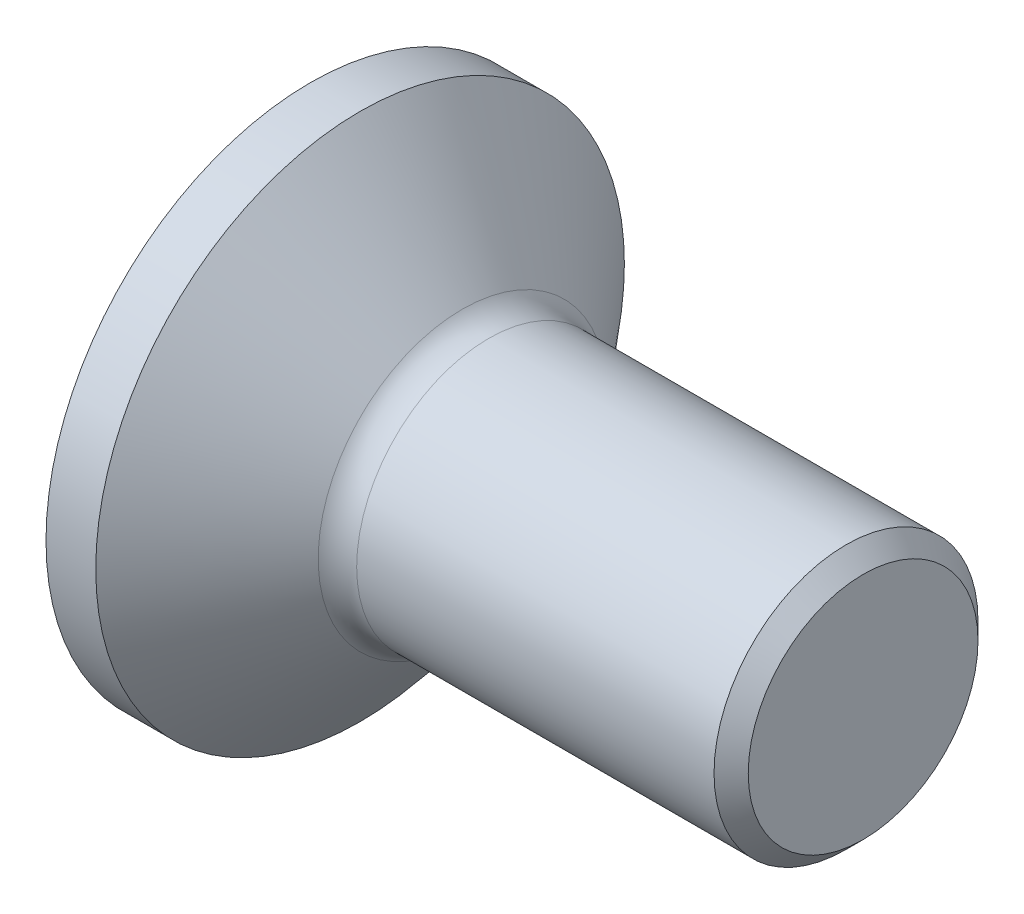
ISO-10303-21;
HEADER;
FILE_DESCRIPTION(('STEP AP214'),'2;1');
FILE_NAME('part.step','',(''),(''),'','','');
FILE_SCHEMA(('AUTOMOTIVE_DESIGN { 1 0 10303 214 1 1 1 1 }'));
ENDSEC;
DATA;
#1=APPLICATION_CONTEXT('core data for automotive mechanical design processes');
#2=APPLICATION_PROTOCOL_DEFINITION('international standard','automotive_design',2000,#1);
#3=PRODUCT_CONTEXT('',#1,'mechanical');
#4=PRODUCT('Part','Part','',(#3));
#5=PRODUCT_RELATED_PRODUCT_CATEGORY('part','',(#4));
#6=PRODUCT_DEFINITION_FORMATION('','',#4);
#7=PRODUCT_DEFINITION_CONTEXT('part definition',#1,'design');
#8=PRODUCT_DEFINITION('design','',#6,#7);
#9=PRODUCT_DEFINITION_SHAPE('','',#8);
#10=(LENGTH_UNIT() NAMED_UNIT(*) SI_UNIT(.MILLI.,.METRE.));
#11=(NAMED_UNIT(*) PLANE_ANGLE_UNIT() SI_UNIT($,.RADIAN.));
#12=(NAMED_UNIT(*) SI_UNIT($,.STERADIAN.) SOLID_ANGLE_UNIT());
#13=UNCERTAINTY_MEASURE_WITH_UNIT(LENGTH_MEASURE(1.E-05),#10,'distance_accuracy_value','');
#14=(GEOMETRIC_REPRESENTATION_CONTEXT(3) GLOBAL_UNCERTAINTY_ASSIGNED_CONTEXT((#13)) GLOBAL_UNIT_ASSIGNED_CONTEXT((#10,
#11,#12)) REPRESENTATION_CONTEXT('',''));
#15=CARTESIAN_POINT('',(0.,0.,0.));
#16=DIRECTION('',(0.,0.,1.));
#17=DIRECTION('',(1.,0.,0.));
#18=AXIS2_PLACEMENT_3D('',#15,#16,#17);
#19=CARTESIAN_POINT('',(2.58077461814255,0.,0.));
#20=DIRECTION('',(1.,0.,0.));
#21=DIRECTION('',(0.,1.,0.));
#22=AXIS2_PLACEMENT_3D('',#19,#20,#21);
#23=TOROIDAL_SURFACE('',#22,2.41,0.5);
#24=CARTESIAN_POINT('',(2.2,0.,0.));
#25=DIRECTION('',(1.,0.,0.));
#26=DIRECTION('',(0.,1.,0.));
#27=AXIS2_PLACEMENT_3D('',#24,#25,#26);
#28=CIRCLE('',#27,2.08594647019606);
#29=CARTESIAN_POINT('',(2.2,2.08594647019606,0.));
#30=VERTEX_POINT('',#29);
#31=EDGE_CURVE('E134',#30,#30,#28,.T.);
#32=ORIENTED_EDGE('',*,*,#31,.T.);
#33=EDGE_LOOP('',(#32));
#34=FACE_BOUND('',#33,.T.);
#35=CARTESIAN_POINT('',(2.58077461814255,0.,0.));
#36=DIRECTION('',(1.,0.,0.));
#37=DIRECTION('',(0.,1.,0.));
#38=AXIS2_PLACEMENT_3D('',#35,#36,#37);
#39=CIRCLE('',#38,1.91);
#40=CARTESIAN_POINT('',(2.58077461814255,1.91,0.));
#41=VERTEX_POINT('',#40);
#42=EDGE_CURVE('E11',#41,#41,#39,.T.);
#43=ORIENTED_EDGE('',*,*,#42,.F.);
#44=EDGE_LOOP('',(#43));
#45=FACE_BOUND('',#44,.T.);
#46=ADVANCED_FACE('F33',(#34,#45),#23,.F.);
#47=CARTESIAN_POINT('',(0.,0.,0.));
#48=DIRECTION('',(1.,0.,0.));
#49=DIRECTION('',(0.,1.,0.));
#50=AXIS2_PLACEMENT_3D('',#47,#48,#49);
#51=CYLINDRICAL_SURFACE('',#50,1.91);
#52=ORIENTED_EDGE('',*,*,#42,.T.);
#53=EDGE_LOOP('',(#52));
#54=FACE_BOUND('',#53,.T.);
#55=CARTESIAN_POINT('',(7.75251262658471,0.,0.));
#56=DIRECTION('',(1.,0.,0.));
#57=DIRECTION('',(0.,1.,0.));
#58=AXIS2_PLACEMENT_3D('',#55,#56,#57);
#59=CIRCLE('',#58,1.91);
#60=CARTESIAN_POINT('',(7.75251262658471,1.91,0.));
#61=VERTEX_POINT('',#60);
#62=EDGE_CURVE('E40',#61,#61,#59,.T.);
#63=ORIENTED_EDGE('',*,*,#62,.F.);
#64=EDGE_LOOP('',(#63));
#65=FACE_BOUND('',#64,.T.);
#66=ADVANCED_FACE('F156',(#54,#65),#51,.T.);
#67=CARTESIAN_POINT('',(8.,0.,0.));
#68=DIRECTION('',(-1.,0.,0.));
#69=DIRECTION('',(0.,-1.,0.));
#70=AXIS2_PLACEMENT_3D('',#67,#68,#69);
#71=CONICAL_SURFACE('',#70,1.66251262658471,0.785398163397452);
#72=ORIENTED_EDGE('',*,*,#62,.T.);
#73=EDGE_LOOP('',(#72));
#74=FACE_BOUND('',#73,.T.);
#75=CARTESIAN_POINT('',(8.,0.,0.));
#76=DIRECTION('',(1.,0.,0.));
#77=DIRECTION('',(0.,1.,0.));
#78=AXIS2_PLACEMENT_3D('',#75,#76,#77);
#79=CIRCLE('',#78,1.66251262658471);
#80=CARTESIAN_POINT('',(8.,1.66251262658471,0.));
#81=VERTEX_POINT('',#80);
#82=EDGE_CURVE('E148',#81,#81,#79,.T.);
#83=ORIENTED_EDGE('',*,*,#82,.F.);
#84=EDGE_LOOP('',(#83));
#85=FACE_BOUND('',#84,.T.);
#86=ADVANCED_FACE('F153',(#74,#85),#71,.T.);
#87=CARTESIAN_POINT('',(8.,1.66251262658471,0.));
#88=DIRECTION('',(1.,0.,0.));
#89=DIRECTION('',(0.,1.,0.));
#90=AXIS2_PLACEMENT_3D('',#87,#88,#89);
#91=PLANE('',#90);
#92=ORIENTED_EDGE('',*,*,#82,.T.);
#93=EDGE_LOOP('',(#92));
#94=FACE_BOUND('',#93,.T.);
#95=ADVANCED_FACE('F163',(#94),#91,.T.);
#96=CARTESIAN_POINT('',(0.,3.825,0.));
#97=DIRECTION('',(-1.,0.,0.));
#98=DIRECTION('',(0.,-1.,0.));
#99=AXIS2_PLACEMENT_3D('',#96,#97,#98);
#100=PLANE('',#99);
#101=DIRECTION('',(0.,1.,0.));
#102=VECTOR('',#101,1.);
#103=CARTESIAN_POINT('',(0.,-0.721687836487033,1.25));
#104=LINE('',#103,#102);
#105=CARTESIAN_POINT('',(0.,-0.721687836487033,1.25));
#106=VERTEX_POINT('',#105);
#107=CARTESIAN_POINT('',(0.,0.721687836487032,1.25));
#108=VERTEX_POINT('',#107);
#109=EDGE_CURVE('E47',#106,#108,#104,.T.);
#110=ORIENTED_EDGE('',*,*,#109,.F.);
#111=DIRECTION('',(0.,0.5,0.866025403784439));
#112=VECTOR('',#111,1.);
#113=CARTESIAN_POINT('',(0.,-1.44337567297406,0.));
#114=LINE('',#113,#112);
#115=CARTESIAN_POINT('',(0.,-1.44337567297406,0.));
#116=VERTEX_POINT('',#115);
#117=EDGE_CURVE('E130',#116,#106,#114,.T.);
#118=ORIENTED_EDGE('',*,*,#117,.F.);
#119=DIRECTION('',(0.,-0.5,0.866025403784439));
#120=VECTOR('',#119,1.);
#121=CARTESIAN_POINT('',(0.,-0.721687836487032,-1.25));
#122=LINE('',#121,#120);
#123=CARTESIAN_POINT('',(0.,-0.721687836487032,-1.25));
#124=VERTEX_POINT('',#123);
#125=EDGE_CURVE('E128',#124,#116,#122,.T.);
#126=ORIENTED_EDGE('',*,*,#125,.F.);
#127=DIRECTION('',(0.,-1.,0.));
#128=VECTOR('',#127,1.);
#129=CARTESIAN_POINT('',(0.,0.721687836487032,-1.25));
#130=LINE('',#129,#128);
#131=CARTESIAN_POINT('',(0.,0.721687836487032,-1.25));
#132=VERTEX_POINT('',#131);
#133=EDGE_CURVE('E95',#132,#124,#130,.T.);
#134=ORIENTED_EDGE('',*,*,#133,.F.);
#135=DIRECTION('',(0.,-0.5,-0.866025403784439));
#136=VECTOR('',#135,1.);
#137=CARTESIAN_POINT('',(0.,1.44337567297406,0.));
#138=LINE('',#137,#136);
#139=CARTESIAN_POINT('',(0.,1.44337567297406,0.));
#140=VERTEX_POINT('',#139);
#141=EDGE_CURVE('E124',#140,#132,#138,.T.);
#142=ORIENTED_EDGE('',*,*,#141,.F.);
#143=DIRECTION('',(0.,0.5,-0.866025403784439));
#144=VECTOR('',#143,1.);
#145=CARTESIAN_POINT('',(0.,0.721687836487032,1.25));
#146=LINE('',#145,#144);
#147=EDGE_CURVE('E121',#108,#140,#146,.T.);
#148=ORIENTED_EDGE('',*,*,#147,.F.);
#149=EDGE_LOOP('',(#110,#118,#126,#134,#142,#148));
#150=FACE_BOUND('',#149,.T.);
#151=CARTESIAN_POINT('',(0.,0.,0.));
#152=DIRECTION('',(1.,0.,0.));
#153=DIRECTION('',(0.,1.,0.));
#154=AXIS2_PLACEMENT_3D('',#151,#152,#153);
#155=CIRCLE('',#154,3.825);
#156=CARTESIAN_POINT('',(0.,3.825,0.));
#157=VERTEX_POINT('',#156);
#158=EDGE_CURVE('E145',#157,#157,#155,.T.);
#159=ORIENTED_EDGE('',*,*,#158,.F.);
#160=EDGE_LOOP('',(#159));
#161=FACE_BOUND('',#160,.T.);
#162=ADVANCED_FACE('F169',(#150,#161),#100,.T.);
#163=CARTESIAN_POINT('',(0.,0.,0.));
#164=DIRECTION('',(1.,0.,0.));
#165=DIRECTION('',(0.,1.,0.));
#166=AXIS2_PLACEMENT_3D('',#163,#164,#165);
#167=CYLINDRICAL_SURFACE('',#166,3.825);
#168=ORIENTED_EDGE('',*,*,#158,.T.);
#169=EDGE_LOOP('',(#168));
#170=FACE_BOUND('',#169,.T.);
#171=CARTESIAN_POINT('',(0.72,0.,0.));
#172=DIRECTION('',(1.,0.,0.));
#173=DIRECTION('',(0.,1.,0.));
#174=AXIS2_PLACEMENT_3D('',#171,#172,#173);
#175=CIRCLE('',#174,3.825);
#176=CARTESIAN_POINT('',(0.72,3.825,0.));
#177=VERTEX_POINT('',#176);
#178=EDGE_CURVE('E142',#177,#177,#175,.T.);
#179=ORIENTED_EDGE('',*,*,#178,.F.);
#180=EDGE_LOOP('',(#179));
#181=FACE_BOUND('',#180,.T.);
#182=ADVANCED_FACE('F173',(#170,#181),#167,.T.);
#183=CARTESIAN_POINT('',(2.2,0.,0.));
#184=DIRECTION('',(-1.,0.,0.));
#185=DIRECTION('',(0.,-1.,0.));
#186=AXIS2_PLACEMENT_3D('',#183,#184,#185);
#187=CONICAL_SURFACE('',#186,2.08594647019606,0.86570017138859);
#188=ORIENTED_EDGE('',*,*,#178,.T.);
#189=EDGE_LOOP('',(#188));
#190=FACE_BOUND('',#189,.T.);
#191=ORIENTED_EDGE('',*,*,#31,.F.);
#192=EDGE_LOOP('',(#191));
#193=FACE_BOUND('',#192,.T.);
#194=ADVANCED_FACE('F177',(#190,#193),#187,.T.);
#195=CARTESIAN_POINT('',(1.5,-0.721687836487033,1.25));
#196=DIRECTION('',(0.,0.,1.));
#197=DIRECTION('',(0.,-1.,0.));
#198=AXIS2_PLACEMENT_3D('',#195,#196,#197);
#199=PLANE('',#198);
#200=ORIENTED_EDGE('',*,*,#109,.T.);
#201=DIRECTION('',(-1.,0.,0.));
#202=VECTOR('',#201,1.);
#203=CARTESIAN_POINT('',(1.5,0.721687836487032,1.25));
#204=LINE('',#203,#202);
#205=CARTESIAN_POINT('',(1.5,0.721687836487032,1.25));
#206=VERTEX_POINT('',#205);
#207=EDGE_CURVE('E77',#206,#108,#204,.T.);
#208=ORIENTED_EDGE('',*,*,#207,.F.);
#209=DIRECTION('',(0.,1.,0.));
#210=VECTOR('',#209,1.);
#211=CARTESIAN_POINT('',(1.5,-0.721687836487033,1.25));
#212=LINE('',#211,#210);
#213=CARTESIAN_POINT('',(1.5,-0.721687836487033,1.25));
#214=VERTEX_POINT('',#213);
#215=EDGE_CURVE('E132',#214,#206,#212,.T.);
#216=ORIENTED_EDGE('',*,*,#215,.F.);
#217=DIRECTION('',(-1.,0.,0.));
#218=VECTOR('',#217,1.);
#219=CARTESIAN_POINT('',(1.5,-0.721687836487033,1.25));
#220=LINE('',#219,#218);
#221=EDGE_CURVE('E55',#214,#106,#220,.T.);
#222=ORIENTED_EDGE('',*,*,#221,.T.);
#223=EDGE_LOOP('',(#200,#208,#216,#222));
#224=FACE_BOUND('',#223,.T.);
#225=ADVANCED_FACE('F181',(#224),#199,.F.);
#226=CARTESIAN_POINT('',(1.5,-1.44337567297406,0.));
#227=DIRECTION('',(0.,-0.866025403784439,0.5));
#228=DIRECTION('',(0.,-0.5,-0.866025403784439));
#229=AXIS2_PLACEMENT_3D('',#226,#227,#228);
#230=PLANE('',#229);
#231=ORIENTED_EDGE('',*,*,#117,.T.);
#232=ORIENTED_EDGE('',*,*,#221,.F.);
#233=DIRECTION('',(0.,0.5,0.866025403784439));
#234=VECTOR('',#233,1.);
#235=CARTESIAN_POINT('',(1.5,-1.44337567297406,0.));
#236=LINE('',#235,#234);
#237=CARTESIAN_POINT('',(1.5,-1.44337567297406,0.));
#238=VERTEX_POINT('',#237);
#239=EDGE_CURVE('E107',#238,#214,#236,.T.);
#240=ORIENTED_EDGE('',*,*,#239,.F.);
#241=DIRECTION('',(-1.,0.,0.));
#242=VECTOR('',#241,1.);
#243=CARTESIAN_POINT('',(1.5,-1.44337567297406,0.));
#244=LINE('',#243,#242);
#245=EDGE_CURVE('E99',#238,#116,#244,.T.);
#246=ORIENTED_EDGE('',*,*,#245,.T.);
#247=EDGE_LOOP('',(#231,#232,#240,#246));
#248=FACE_BOUND('',#247,.T.);
#249=ADVANCED_FACE('F185',(#248),#230,.F.);
#250=CARTESIAN_POINT('',(1.5,-0.721687836487032,-1.25));
#251=DIRECTION('',(0.,-0.866025403784439,-0.5));
#252=DIRECTION('',(0.,0.5,-0.866025403784439));
#253=AXIS2_PLACEMENT_3D('',#250,#251,#252);
#254=PLANE('',#253);
#255=ORIENTED_EDGE('',*,*,#125,.T.);
#256=ORIENTED_EDGE('',*,*,#245,.F.);
#257=DIRECTION('',(0.,-0.5,0.866025403784439));
#258=VECTOR('',#257,1.);
#259=CARTESIAN_POINT('',(1.5,-0.721687836487032,-1.25));
#260=LINE('',#259,#258);
#261=CARTESIAN_POINT('',(1.5,-0.721687836487032,-1.25));
#262=VERTEX_POINT('',#261);
#263=EDGE_CURVE('E103',#262,#238,#260,.T.);
#264=ORIENTED_EDGE('',*,*,#263,.F.);
#265=DIRECTION('',(-1.,0.,0.));
#266=VECTOR('',#265,1.);
#267=CARTESIAN_POINT('',(1.5,-0.721687836487032,-1.25));
#268=LINE('',#267,#266);
#269=EDGE_CURVE('E88',#262,#124,#268,.T.);
#270=ORIENTED_EDGE('',*,*,#269,.T.);
#271=EDGE_LOOP('',(#255,#256,#264,#270));
#272=FACE_BOUND('',#271,.T.);
#273=ADVANCED_FACE('F104',(#272),#254,.F.);
#274=CARTESIAN_POINT('',(1.5,0.721687836487032,-1.25));
#275=DIRECTION('',(0.,0.,-1.));
#276=DIRECTION('',(-1.,0.,0.));
#277=AXIS2_PLACEMENT_3D('',#274,#275,#276);
#278=PLANE('',#277);
#279=ORIENTED_EDGE('',*,*,#133,.T.);
#280=ORIENTED_EDGE('',*,*,#269,.F.);
#281=DIRECTION('',(0.,-1.,0.));
#282=VECTOR('',#281,1.);
#283=CARTESIAN_POINT('',(1.5,0.721687836487032,-1.25));
#284=LINE('',#283,#282);
#285=CARTESIAN_POINT('',(1.5,0.721687836487032,-1.25));
#286=VERTEX_POINT('',#285);
#287=EDGE_CURVE('E92',#286,#262,#284,.T.);
#288=ORIENTED_EDGE('',*,*,#287,.F.);
#289=DIRECTION('',(-1.,0.,0.));
#290=VECTOR('',#289,1.);
#291=CARTESIAN_POINT('',(1.5,0.721687836487032,-1.25));
#292=LINE('',#291,#290);
#293=EDGE_CURVE('E100',#286,#132,#292,.T.);
#294=ORIENTED_EDGE('',*,*,#293,.T.);
#295=EDGE_LOOP('',(#279,#280,#288,#294));
#296=FACE_BOUND('',#295,.T.);
#297=ADVANCED_FACE('F90',(#296),#278,.F.);
#298=CARTESIAN_POINT('',(1.5,1.44337567297406,0.));
#299=DIRECTION('',(0.,0.866025403784439,-0.5));
#300=DIRECTION('',(0.,0.5,0.866025403784439));
#301=AXIS2_PLACEMENT_3D('',#298,#299,#300);
#302=PLANE('',#301);
#303=ORIENTED_EDGE('',*,*,#141,.T.);
#304=ORIENTED_EDGE('',*,*,#293,.F.);
#305=DIRECTION('',(0.,-0.5,-0.866025403784439));
#306=VECTOR('',#305,1.);
#307=CARTESIAN_POINT('',(1.5,1.44337567297406,0.));
#308=LINE('',#307,#306);
#309=CARTESIAN_POINT('',(1.5,1.44337567297406,0.));
#310=VERTEX_POINT('',#309);
#311=EDGE_CURVE('E113',#310,#286,#308,.T.);
#312=ORIENTED_EDGE('',*,*,#311,.F.);
#313=DIRECTION('',(-1.,0.,0.));
#314=VECTOR('',#313,1.);
#315=CARTESIAN_POINT('',(1.5,1.44337567297406,0.));
#316=LINE('',#315,#314);
#317=EDGE_CURVE('E137',#310,#140,#316,.T.);
#318=ORIENTED_EDGE('',*,*,#317,.T.);
#319=EDGE_LOOP('',(#303,#304,#312,#318));
#320=FACE_BOUND('',#319,.T.);
#321=ADVANCED_FACE('F189',(#320),#302,.F.);
#322=CARTESIAN_POINT('',(1.5,0.721687836487032,1.25));
#323=DIRECTION('',(0.,0.866025403784439,0.5));
#324=DIRECTION('',(0.,-0.5,0.866025403784439));
#325=AXIS2_PLACEMENT_3D('',#322,#323,#324);
#326=PLANE('',#325);
#327=ORIENTED_EDGE('',*,*,#147,.T.);
#328=ORIENTED_EDGE('',*,*,#317,.F.);
#329=DIRECTION('',(0.,0.5,-0.866025403784439));
#330=VECTOR('',#329,1.);
#331=CARTESIAN_POINT('',(1.5,0.721687836487032,1.25));
#332=LINE('',#331,#330);
#333=EDGE_CURVE('E115',#206,#310,#332,.T.);
#334=ORIENTED_EDGE('',*,*,#333,.F.);
#335=ORIENTED_EDGE('',*,*,#207,.T.);
#336=EDGE_LOOP('',(#327,#328,#334,#335));
#337=FACE_BOUND('',#336,.T.);
#338=ADVANCED_FACE('F186',(#337),#326,.F.);
#339=CARTESIAN_POINT('',(1.5,0.,0.));
#340=DIRECTION('',(-1.,0.,0.));
#341=DIRECTION('',(0.,-1.,0.));
#342=AXIS2_PLACEMENT_3D('',#339,#340,#341);
#343=PLANE('',#342);
#344=ORIENTED_EDGE('',*,*,#215,.T.);
#345=ORIENTED_EDGE('',*,*,#333,.T.);
#346=ORIENTED_EDGE('',*,*,#311,.T.);
#347=ORIENTED_EDGE('',*,*,#287,.T.);
#348=ORIENTED_EDGE('',*,*,#263,.T.);
#349=ORIENTED_EDGE('',*,*,#239,.T.);
#350=EDGE_LOOP('',(#344,#345,#346,#347,#348,#349));
#351=FACE_BOUND('',#350,.T.);
#352=ADVANCED_FACE('F110',(#351),#343,.T.);
#353=CLOSED_SHELL('',(#46,#66,#86,#95,#162,#182,#194,#225,#249,#273,#297,#321,#338,#352));
#354=MANIFOLD_SOLID_BREP('B2',#353);
#355=ADVANCED_BREP_SHAPE_REPRESENTATION('',(#18,#354),#14);
#356=SHAPE_DEFINITION_REPRESENTATION(#9,#355);
ENDSEC;
END-ISO-10303-21;
